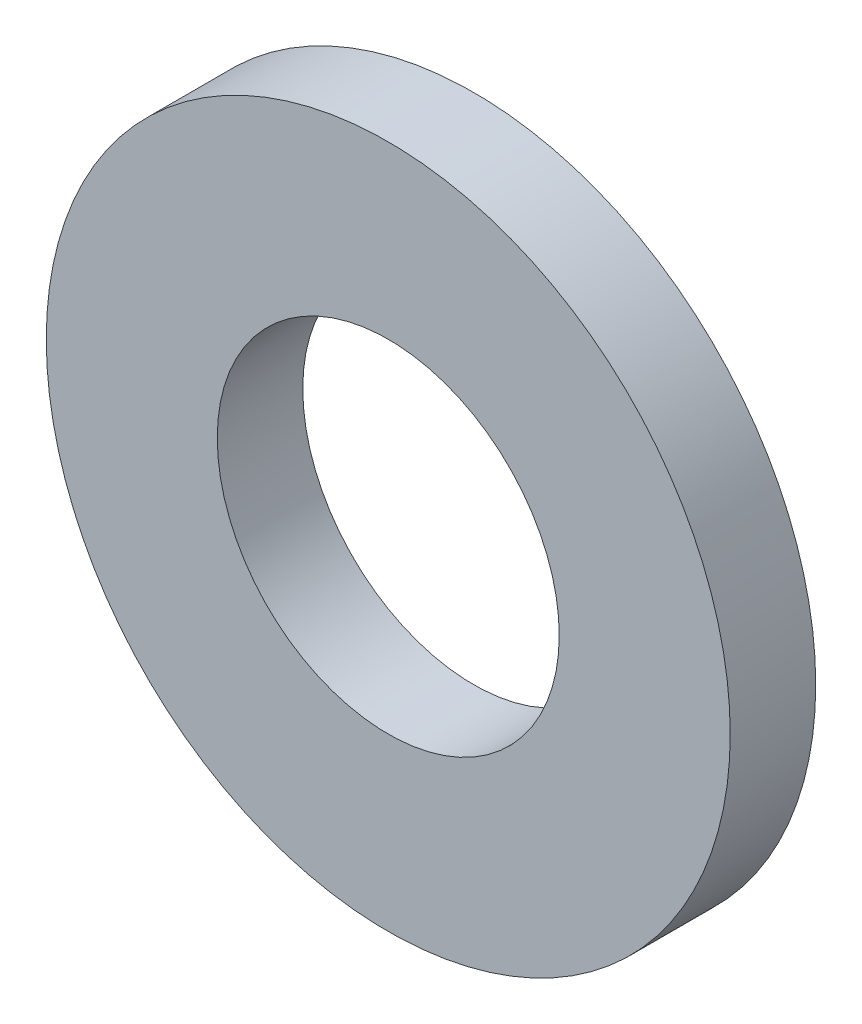
ISO-10303-21;
HEADER;
FILE_DESCRIPTION(('STEP AP214'),'2;1');
FILE_NAME('part.step','',(''),(''),'','','');
FILE_SCHEMA(('AUTOMOTIVE_DESIGN { 1 0 10303 214 1 1 1 1 }'));
ENDSEC;
DATA;
#1=APPLICATION_CONTEXT('core data for automotive mechanical design processes');
#2=APPLICATION_PROTOCOL_DEFINITION('international standard','automotive_design',2000,#1);
#3=PRODUCT_CONTEXT('',#1,'mechanical');
#4=PRODUCT('Part','Part','',(#3));
#5=PRODUCT_RELATED_PRODUCT_CATEGORY('part','',(#4));
#6=PRODUCT_DEFINITION_FORMATION('','',#4);
#7=PRODUCT_DEFINITION_CONTEXT('part definition',#1,'design');
#8=PRODUCT_DEFINITION('design','',#6,#7);
#9=PRODUCT_DEFINITION_SHAPE('','',#8);
#10=(LENGTH_UNIT() NAMED_UNIT(*) SI_UNIT(.MILLI.,.METRE.));
#11=(NAMED_UNIT(*) PLANE_ANGLE_UNIT() SI_UNIT($,.RADIAN.));
#12=(NAMED_UNIT(*) SI_UNIT($,.STERADIAN.) SOLID_ANGLE_UNIT());
#13=UNCERTAINTY_MEASURE_WITH_UNIT(LENGTH_MEASURE(1.E-05),#10,'distance_accuracy_value','');
#14=(GEOMETRIC_REPRESENTATION_CONTEXT(3) GLOBAL_UNCERTAINTY_ASSIGNED_CONTEXT((#13)) GLOBAL_UNIT_ASSIGNED_CONTEXT((#10,
#11,#12)) REPRESENTATION_CONTEXT('',''));
#15=CARTESIAN_POINT('',(0.,0.,0.));
#16=DIRECTION('',(0.,0.,1.));
#17=DIRECTION('',(1.,0.,0.));
#18=AXIS2_PLACEMENT_3D('',#15,#16,#17);
#19=CARTESIAN_POINT('',(0.,0.,0.5));
#20=DIRECTION('',(0.,0.,1.));
#21=DIRECTION('',(1.,0.,0.));
#22=AXIS2_PLACEMENT_3D('',#19,#20,#21);
#23=PLANE('',#22);
#24=CARTESIAN_POINT('',(0.,0.,0.5));
#25=DIRECTION('',(0.,0.,1.));
#26=DIRECTION('',(1.,0.,0.));
#27=AXIS2_PLACEMENT_3D('',#24,#25,#26);
#28=CIRCLE('',#27,2.);
#29=CARTESIAN_POINT('',(2.,0.,0.5));
#30=VERTEX_POINT('',#29);
#31=EDGE_CURVE('E10',#30,#30,#28,.T.);
#32=ORIENTED_EDGE('',*,*,#31,.T.);
#33=EDGE_LOOP('',(#32));
#34=FACE_BOUND('',#33,.T.);
#35=CARTESIAN_POINT('',(0.,0.,0.5));
#36=DIRECTION('',(0.,0.,1.));
#37=DIRECTION('',(1.,0.,0.));
#38=AXIS2_PLACEMENT_3D('',#35,#36,#37);
#39=CIRCLE('',#38,1.);
#40=CARTESIAN_POINT('',(1.,0.,0.5));
#41=VERTEX_POINT('',#40);
#42=EDGE_CURVE('E46',#41,#41,#39,.T.);
#43=ORIENTED_EDGE('',*,*,#42,.F.);
#44=EDGE_LOOP('',(#43));
#45=FACE_BOUND('',#44,.T.);
#46=ADVANCED_FACE('F35',(#34,#45),#23,.T.);
#47=CARTESIAN_POINT('',(0.,0.,0.));
#48=DIRECTION('',(0.,0.,1.));
#49=DIRECTION('',(1.,0.,0.));
#50=AXIS2_PLACEMENT_3D('',#47,#48,#49);
#51=PLANE('',#50);
#52=CARTESIAN_POINT('',(0.,0.,0.));
#53=DIRECTION('',(0.,0.,1.));
#54=DIRECTION('',(1.,0.,0.));
#55=AXIS2_PLACEMENT_3D('',#52,#53,#54);
#56=CIRCLE('',#55,2.);
#57=CARTESIAN_POINT('',(2.,0.,0.));
#58=VERTEX_POINT('',#57);
#59=EDGE_CURVE('E39',#58,#58,#56,.T.);
#60=ORIENTED_EDGE('',*,*,#59,.F.);
#61=EDGE_LOOP('',(#60));
#62=FACE_BOUND('',#61,.T.);
#63=CARTESIAN_POINT('',(0.,0.,0.));
#64=DIRECTION('',(0.,0.,1.));
#65=DIRECTION('',(1.,0.,0.));
#66=AXIS2_PLACEMENT_3D('',#63,#64,#65);
#67=CIRCLE('',#66,1.);
#68=CARTESIAN_POINT('',(1.,0.,0.));
#69=VERTEX_POINT('',#68);
#70=EDGE_CURVE('E48',#69,#69,#67,.T.);
#71=ORIENTED_EDGE('',*,*,#70,.T.);
#72=EDGE_LOOP('',(#71));
#73=FACE_BOUND('',#72,.T.);
#74=ADVANCED_FACE('F58',(#62,#73),#51,.F.);
#75=CARTESIAN_POINT('',(0.,0.,0.5));
#76=DIRECTION('',(0.,0.,-1.));
#77=DIRECTION('',(-1.,0.,0.));
#78=AXIS2_PLACEMENT_3D('',#75,#76,#77);
#79=CYLINDRICAL_SURFACE('',#78,2.);
#80=ORIENTED_EDGE('',*,*,#31,.F.);
#81=EDGE_LOOP('',(#80));
#82=FACE_BOUND('',#81,.T.);
#83=ORIENTED_EDGE('',*,*,#59,.T.);
#84=EDGE_LOOP('',(#83));
#85=FACE_BOUND('',#84,.T.);
#86=ADVANCED_FACE('F37',(#82,#85),#79,.T.);
#87=CARTESIAN_POINT('',(0.,0.,0.5));
#88=DIRECTION('',(0.,0.,-1.));
#89=DIRECTION('',(-1.,0.,0.));
#90=AXIS2_PLACEMENT_3D('',#87,#88,#89);
#91=CYLINDRICAL_SURFACE('',#90,1.);
#92=ORIENTED_EDGE('',*,*,#42,.T.);
#93=EDGE_LOOP('',(#92));
#94=FACE_BOUND('',#93,.T.);
#95=ORIENTED_EDGE('',*,*,#70,.F.);
#96=EDGE_LOOP('',(#95));
#97=FACE_BOUND('',#96,.T.);
#98=ADVANCED_FACE('F54',(#94,#97),#91,.F.);
#99=CLOSED_SHELL('',(#46,#74,#86,#98));
#100=MANIFOLD_SOLID_BREP('B2',#99);
#101=ADVANCED_BREP_SHAPE_REPRESENTATION('',(#18,#100),#14);
#102=SHAPE_DEFINITION_REPRESENTATION(#9,#101);
ENDSEC;
END-ISO-10303-21;
